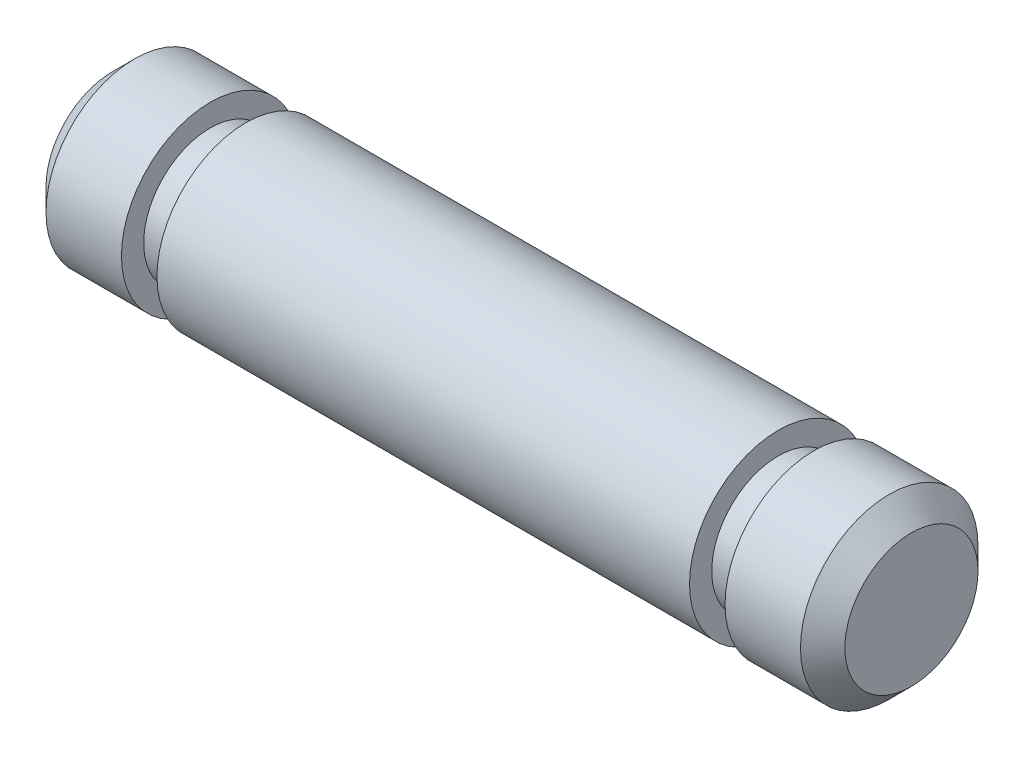
ISO-10303-21;
HEADER;
FILE_DESCRIPTION(('STEP AP214'),'2;1');
FILE_NAME('part.step','',(''),(''),'','','');
FILE_SCHEMA(('AUTOMOTIVE_DESIGN { 1 0 10303 214 1 1 1 1 }'));
ENDSEC;
DATA;
#1=APPLICATION_CONTEXT('core data for automotive mechanical design processes');
#2=APPLICATION_PROTOCOL_DEFINITION('international standard','automotive_design',2000,#1);
#3=PRODUCT_CONTEXT('',#1,'mechanical');
#4=PRODUCT('Part','Part','',(#3));
#5=PRODUCT_RELATED_PRODUCT_CATEGORY('part','',(#4));
#6=PRODUCT_DEFINITION_FORMATION('','',#4);
#7=PRODUCT_DEFINITION_CONTEXT('part definition',#1,'design');
#8=PRODUCT_DEFINITION('design','',#6,#7);
#9=PRODUCT_DEFINITION_SHAPE('','',#8);
#10=(LENGTH_UNIT() NAMED_UNIT(*) SI_UNIT(.MILLI.,.METRE.));
#11=(NAMED_UNIT(*) PLANE_ANGLE_UNIT() SI_UNIT($,.RADIAN.));
#12=(NAMED_UNIT(*) SI_UNIT($,.STERADIAN.) SOLID_ANGLE_UNIT());
#13=UNCERTAINTY_MEASURE_WITH_UNIT(LENGTH_MEASURE(1.E-05),#10,'distance_accuracy_value','');
#14=(GEOMETRIC_REPRESENTATION_CONTEXT(3) GLOBAL_UNCERTAINTY_ASSIGNED_CONTEXT((#13)) GLOBAL_UNIT_ASSIGNED_CONTEXT((#10,
#11,#12)) REPRESENTATION_CONTEXT('',''));
#15=CARTESIAN_POINT('',(0.,0.,0.));
#16=DIRECTION('',(0.,0.,1.));
#17=DIRECTION('',(1.,0.,0.));
#18=AXIS2_PLACEMENT_3D('',#15,#16,#17);
#19=CARTESIAN_POINT('',(6.,0.,0.));
#20=DIRECTION('',(-1.,0.,0.));
#21=DIRECTION('',(0.,0.,1.));
#22=AXIS2_PLACEMENT_3D('',#19,#20,#21);
#23=CYLINDRICAL_SURFACE('',#22,2.);
#24=CARTESIAN_POINT('',(6.,0.,0.));
#25=DIRECTION('',(1.,0.,0.));
#26=DIRECTION('',(0.,0.,-1.));
#27=AXIS2_PLACEMENT_3D('',#24,#25,#26);
#28=CIRCLE('',#27,2.);
#29=CARTESIAN_POINT('',(6.,0.,-2.));
#30=VERTEX_POINT('',#29);
#31=EDGE_CURVE('E72',#30,#30,#28,.T.);
#32=ORIENTED_EDGE('',*,*,#31,.F.);
#33=EDGE_LOOP('',(#32));
#34=FACE_BOUND('',#33,.T.);
#35=CARTESIAN_POINT('',(-6.,0.,0.));
#36=DIRECTION('',(1.,0.,0.));
#37=DIRECTION('',(0.,0.,-1.));
#38=AXIS2_PLACEMENT_3D('',#35,#36,#37);
#39=CIRCLE('',#38,2.);
#40=CARTESIAN_POINT('',(-6.,0.,-2.));
#41=VERTEX_POINT('',#40);
#42=EDGE_CURVE('E68',#41,#41,#39,.T.);
#43=ORIENTED_EDGE('',*,*,#42,.T.);
#44=EDGE_LOOP('',(#43));
#45=FACE_BOUND('',#44,.T.);
#46=ADVANCED_FACE('F42',(#34,#45),#23,.T.);
#47=CARTESIAN_POINT('',(6.,0.,0.));
#48=DIRECTION('',(1.,0.,0.));
#49=DIRECTION('',(0.,0.,-1.));
#50=AXIS2_PLACEMENT_3D('',#47,#48,#49);
#51=PLANE('',#50);
#52=CARTESIAN_POINT('',(6.,0.,0.));
#53=DIRECTION('',(1.,0.,0.));
#54=DIRECTION('',(0.,0.,-1.));
#55=AXIS2_PLACEMENT_3D('',#52,#53,#54);
#56=CIRCLE('',#55,1.5);
#57=CARTESIAN_POINT('',(6.,0.,-1.5));
#58=VERTEX_POINT('',#57);
#59=EDGE_CURVE('E67',#58,#58,#56,.T.);
#60=ORIENTED_EDGE('',*,*,#59,.F.);
#61=EDGE_LOOP('',(#60));
#62=FACE_BOUND('',#61,.T.);
#63=ORIENTED_EDGE('',*,*,#31,.T.);
#64=EDGE_LOOP('',(#63));
#65=FACE_BOUND('',#64,.T.);
#66=ADVANCED_FACE('F119',(#62,#65),#51,.T.);
#67=CARTESIAN_POINT('',(-6.,0.,0.));
#68=DIRECTION('',(1.,0.,0.));
#69=DIRECTION('',(0.,0.,-1.));
#70=AXIS2_PLACEMENT_3D('',#67,#68,#69);
#71=PLANE('',#70);
#72=CARTESIAN_POINT('',(-6.,0.,0.));
#73=DIRECTION('',(1.,0.,0.));
#74=DIRECTION('',(0.,0.,-1.));
#75=AXIS2_PLACEMENT_3D('',#72,#73,#74);
#76=CIRCLE('',#75,1.5);
#77=CARTESIAN_POINT('',(-6.,0.,-1.5));
#78=VERTEX_POINT('',#77);
#79=EDGE_CURVE('E87',#78,#78,#76,.T.);
#80=ORIENTED_EDGE('',*,*,#79,.T.);
#81=EDGE_LOOP('',(#80));
#82=FACE_BOUND('',#81,.T.);
#83=ORIENTED_EDGE('',*,*,#42,.F.);
#84=EDGE_LOOP('',(#83));
#85=FACE_BOUND('',#84,.T.);
#86=ADVANCED_FACE('F125',(#82,#85),#71,.F.);
#87=CARTESIAN_POINT('',(6.8,0.,0.));
#88=DIRECTION('',(-1.,0.,0.));
#89=DIRECTION('',(0.,0.,1.));
#90=AXIS2_PLACEMENT_3D('',#87,#88,#89);
#91=CYLINDRICAL_SURFACE('',#90,1.5);
#92=CARTESIAN_POINT('',(6.8,0.,0.));
#93=DIRECTION('',(1.,0.,0.));
#94=DIRECTION('',(0.,0.,-1.));
#95=AXIS2_PLACEMENT_3D('',#92,#93,#94);
#96=CIRCLE('',#95,1.5);
#97=CARTESIAN_POINT('',(6.8,0.,-1.5));
#98=VERTEX_POINT('',#97);
#99=EDGE_CURVE('E73',#98,#98,#96,.T.);
#100=ORIENTED_EDGE('',*,*,#99,.F.);
#101=EDGE_LOOP('',(#100));
#102=FACE_BOUND('',#101,.T.);
#103=ORIENTED_EDGE('',*,*,#59,.T.);
#104=EDGE_LOOP('',(#103));
#105=FACE_BOUND('',#104,.T.);
#106=ADVANCED_FACE('F154',(#102,#105),#91,.T.);
#107=CARTESIAN_POINT('',(9.,0.,0.));
#108=DIRECTION('',(-1.,0.,0.));
#109=DIRECTION('',(0.,0.,1.));
#110=AXIS2_PLACEMENT_3D('',#107,#108,#109);
#111=CYLINDRICAL_SURFACE('',#110,2.);
#112=CARTESIAN_POINT('',(8.5,0.,0.));
#113=DIRECTION('',(1.,0.,0.));
#114=DIRECTION('',(0.,0.,-1.));
#115=AXIS2_PLACEMENT_3D('',#112,#113,#114);
#116=CIRCLE('',#115,2.);
#117=CARTESIAN_POINT('',(8.5,0.,-2.));
#118=VERTEX_POINT('',#117);
#119=EDGE_CURVE('E10',#118,#118,#116,.F.);
#120=ORIENTED_EDGE('',*,*,#119,.T.);
#121=EDGE_LOOP('',(#120));
#122=FACE_BOUND('',#121,.T.);
#123=CARTESIAN_POINT('',(6.8,0.,0.));
#124=DIRECTION('',(1.,0.,0.));
#125=DIRECTION('',(0.,0.,-1.));
#126=AXIS2_PLACEMENT_3D('',#123,#124,#125);
#127=CIRCLE('',#126,2.);
#128=CARTESIAN_POINT('',(6.8,0.,-2.));
#129=VERTEX_POINT('',#128);
#130=EDGE_CURVE('E83',#129,#129,#127,.T.);
#131=ORIENTED_EDGE('',*,*,#130,.T.);
#132=EDGE_LOOP('',(#131));
#133=FACE_BOUND('',#132,.T.);
#134=ADVANCED_FACE('F159',(#122,#133),#111,.T.);
#135=CARTESIAN_POINT('',(9.,0.,0.));
#136=DIRECTION('',(1.,0.,0.));
#137=DIRECTION('',(0.,0.,-1.));
#138=AXIS2_PLACEMENT_3D('',#135,#136,#137);
#139=PLANE('',#138);
#140=CARTESIAN_POINT('',(9.,0.,0.));
#141=DIRECTION('',(1.,0.,0.));
#142=DIRECTION('',(0.,0.,-1.));
#143=AXIS2_PLACEMENT_3D('',#140,#141,#142);
#144=CIRCLE('',#143,1.5);
#145=CARTESIAN_POINT('',(9.,0.,-1.5));
#146=VERTEX_POINT('',#145);
#147=EDGE_CURVE('E51',#146,#146,#144,.T.);
#148=ORIENTED_EDGE('',*,*,#147,.T.);
#149=EDGE_LOOP('',(#148));
#150=FACE_BOUND('',#149,.T.);
#151=ADVANCED_FACE('F165',(#150),#139,.T.);
#152=CARTESIAN_POINT('',(6.8,0.,0.));
#153=DIRECTION('',(1.,0.,0.));
#154=DIRECTION('',(0.,0.,-1.));
#155=AXIS2_PLACEMENT_3D('',#152,#153,#154);
#156=PLANE('',#155);
#157=ORIENTED_EDGE('',*,*,#99,.T.);
#158=EDGE_LOOP('',(#157));
#159=FACE_BOUND('',#158,.T.);
#160=ORIENTED_EDGE('',*,*,#130,.F.);
#161=EDGE_LOOP('',(#160));
#162=FACE_BOUND('',#161,.T.);
#163=ADVANCED_FACE('F114',(#159,#162),#156,.F.);
#164=CARTESIAN_POINT('',(-6.8,0.,0.));
#165=DIRECTION('',(1.,0.,0.));
#166=DIRECTION('',(0.,0.,-1.));
#167=AXIS2_PLACEMENT_3D('',#164,#165,#166);
#168=CYLINDRICAL_SURFACE('',#167,1.5);
#169=CARTESIAN_POINT('',(-6.8,0.,0.));
#170=DIRECTION('',(1.,0.,0.));
#171=DIRECTION('',(0.,0.,-1.));
#172=AXIS2_PLACEMENT_3D('',#169,#170,#171);
#173=CIRCLE('',#172,1.5);
#174=CARTESIAN_POINT('',(-6.8,0.,-1.5));
#175=VERTEX_POINT('',#174);
#176=EDGE_CURVE('E91',#175,#175,#173,.T.);
#177=ORIENTED_EDGE('',*,*,#176,.T.);
#178=EDGE_LOOP('',(#177));
#179=FACE_BOUND('',#178,.T.);
#180=ORIENTED_EDGE('',*,*,#79,.F.);
#181=EDGE_LOOP('',(#180));
#182=FACE_BOUND('',#181,.T.);
#183=ADVANCED_FACE('F105',(#179,#182),#168,.T.);
#184=CARTESIAN_POINT('',(-9.,0.,0.));
#185=DIRECTION('',(1.,0.,0.));
#186=DIRECTION('',(0.,0.,-1.));
#187=AXIS2_PLACEMENT_3D('',#184,#185,#186);
#188=CYLINDRICAL_SURFACE('',#187,2.);
#189=CARTESIAN_POINT('',(-8.5,0.,0.));
#190=DIRECTION('',(-1.,0.,0.));
#191=DIRECTION('',(0.,0.,1.));
#192=AXIS2_PLACEMENT_3D('',#189,#190,#191);
#193=CIRCLE('',#192,2.);
#194=CARTESIAN_POINT('',(-8.5,0.,2.));
#195=VERTEX_POINT('',#194);
#196=EDGE_CURVE('E61',#195,#195,#193,.F.);
#197=ORIENTED_EDGE('',*,*,#196,.T.);
#198=EDGE_LOOP('',(#197));
#199=FACE_BOUND('',#198,.T.);
#200=CARTESIAN_POINT('',(-6.8,0.,0.));
#201=DIRECTION('',(1.,0.,0.));
#202=DIRECTION('',(0.,0.,-1.));
#203=AXIS2_PLACEMENT_3D('',#200,#201,#202);
#204=CIRCLE('',#203,2.);
#205=CARTESIAN_POINT('',(-6.8,0.,-2.));
#206=VERTEX_POINT('',#205);
#207=EDGE_CURVE('E95',#206,#206,#204,.T.);
#208=ORIENTED_EDGE('',*,*,#207,.F.);
#209=EDGE_LOOP('',(#208));
#210=FACE_BOUND('',#209,.T.);
#211=ADVANCED_FACE('F102',(#199,#210),#188,.T.);
#212=CARTESIAN_POINT('',(-9.,0.,0.));
#213=DIRECTION('',(-1.,0.,0.));
#214=DIRECTION('',(0.,0.,-1.));
#215=AXIS2_PLACEMENT_3D('',#212,#213,#214);
#216=PLANE('',#215);
#217=CARTESIAN_POINT('',(-9.,0.,0.));
#218=DIRECTION('',(-1.,0.,0.));
#219=DIRECTION('',(0.,0.,1.));
#220=AXIS2_PLACEMENT_3D('',#217,#218,#219);
#221=CIRCLE('',#220,1.5);
#222=CARTESIAN_POINT('',(-9.,0.,1.5));
#223=VERTEX_POINT('',#222);
#224=EDGE_CURVE('E56',#223,#223,#221,.T.);
#225=ORIENTED_EDGE('',*,*,#224,.T.);
#226=EDGE_LOOP('',(#225));
#227=FACE_BOUND('',#226,.T.);
#228=ADVANCED_FACE('F104',(#227),#216,.T.);
#229=CARTESIAN_POINT('',(-6.8,0.,0.));
#230=DIRECTION('',(-1.,0.,0.));
#231=DIRECTION('',(0.,0.,-1.));
#232=AXIS2_PLACEMENT_3D('',#229,#230,#231);
#233=PLANE('',#232);
#234=ORIENTED_EDGE('',*,*,#176,.F.);
#235=EDGE_LOOP('',(#234));
#236=FACE_BOUND('',#235,.T.);
#237=ORIENTED_EDGE('',*,*,#207,.T.);
#238=EDGE_LOOP('',(#237));
#239=FACE_BOUND('',#238,.T.);
#240=ADVANCED_FACE('F100',(#236,#239),#233,.F.);
#241=CARTESIAN_POINT('',(-8.5,0.,0.));
#242=DIRECTION('',(1.,0.,0.));
#243=DIRECTION('',(0.,0.,-1.));
#244=AXIS2_PLACEMENT_3D('',#241,#242,#243);
#245=CONICAL_SURFACE('',#244,2.,0.785398163397452);
#246=ORIENTED_EDGE('',*,*,#224,.F.);
#247=EDGE_LOOP('',(#246));
#248=FACE_BOUND('',#247,.T.);
#249=ORIENTED_EDGE('',*,*,#196,.F.);
#250=EDGE_LOOP('',(#249));
#251=FACE_BOUND('',#250,.T.);
#252=ADVANCED_FACE('F132',(#248,#251),#245,.T.);
#253=CARTESIAN_POINT('',(9.,0.,0.));
#254=DIRECTION('',(-1.,0.,0.));
#255=DIRECTION('',(0.,0.,1.));
#256=AXIS2_PLACEMENT_3D('',#253,#254,#255);
#257=CONICAL_SURFACE('',#256,1.5,0.785398163397448);
#258=ORIENTED_EDGE('',*,*,#119,.F.);
#259=EDGE_LOOP('',(#258));
#260=FACE_BOUND('',#259,.T.);
#261=ORIENTED_EDGE('',*,*,#147,.F.);
#262=EDGE_LOOP('',(#261));
#263=FACE_BOUND('',#262,.T.);
#264=ADVANCED_FACE('F45',(#260,#263),#257,.T.);
#265=CLOSED_SHELL('',(#46,#66,#86,#106,#134,#151,#163,#183,#211,#228,#240,#252,#264));
#266=MANIFOLD_SOLID_BREP('B2',#265);
#267=ADVANCED_BREP_SHAPE_REPRESENTATION('',(#18,#266),#14);
#268=SHAPE_DEFINITION_REPRESENTATION(#9,#267);
ENDSEC;
END-ISO-10303-21;
